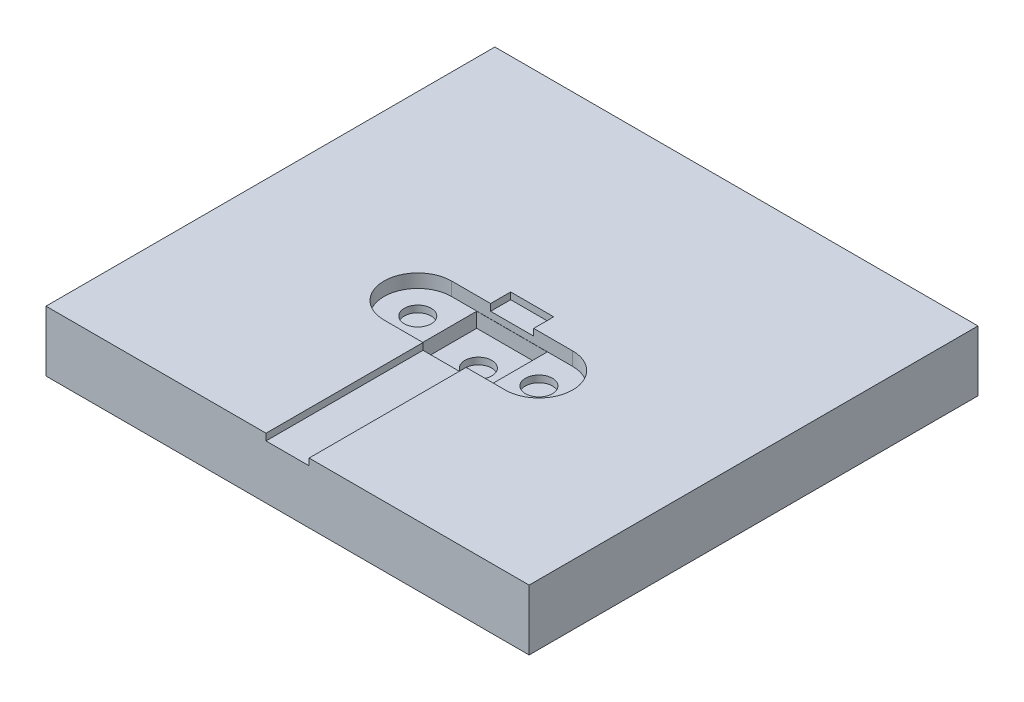
ISO-10303-21;
HEADER;
FILE_DESCRIPTION(('STEP AP214'),'2;1');
FILE_NAME('part.step','',(''),(''),'','','');
FILE_SCHEMA(('AUTOMOTIVE_DESIGN { 1 0 10303 214 1 1 1 1 }'));
ENDSEC;
DATA;
#1=APPLICATION_CONTEXT('core data for automotive mechanical design processes');
#2=APPLICATION_PROTOCOL_DEFINITION('international standard','automotive_design',2000,#1);
#3=PRODUCT_CONTEXT('',#1,'mechanical');
#4=PRODUCT('Part','Part','',(#3));
#5=PRODUCT_RELATED_PRODUCT_CATEGORY('part','',(#4));
#6=PRODUCT_DEFINITION_FORMATION('','',#4);
#7=PRODUCT_DEFINITION_CONTEXT('part definition',#1,'design');
#8=PRODUCT_DEFINITION('design','',#6,#7);
#9=PRODUCT_DEFINITION_SHAPE('','',#8);
#10=(LENGTH_UNIT() NAMED_UNIT(*) SI_UNIT(.MILLI.,.METRE.));
#11=(NAMED_UNIT(*) PLANE_ANGLE_UNIT() SI_UNIT($,.RADIAN.));
#12=(NAMED_UNIT(*) SI_UNIT($,.STERADIAN.) SOLID_ANGLE_UNIT());
#13=UNCERTAINTY_MEASURE_WITH_UNIT(LENGTH_MEASURE(1.E-05),#10,'distance_accuracy_value','');
#14=(GEOMETRIC_REPRESENTATION_CONTEXT(3) GLOBAL_UNCERTAINTY_ASSIGNED_CONTEXT((#13)) GLOBAL_UNIT_ASSIGNED_CONTEXT((#10,
#11,#12)) REPRESENTATION_CONTEXT('',''));
#15=CARTESIAN_POINT('',(0.,0.,0.));
#16=DIRECTION('',(0.,0.,1.));
#17=DIRECTION('',(1.,0.,0.));
#18=AXIS2_PLACEMENT_3D('',#15,#16,#17);
#19=CARTESIAN_POINT('',(33.2622597352939,7.,-145.28784522555));
#20=DIRECTION('',(0.,1.,0.));
#21=DIRECTION('',(0.,0.,1.));
#22=AXIS2_PLACEMENT_3D('',#19,#20,#21);
#23=CYLINDRICAL_SURFACE('',#22,5.02261182793393);
#24=CARTESIAN_POINT('',(33.2622597352939,9.,-145.28784522555));
#25=DIRECTION('',(0.,1.,0.));
#26=DIRECTION('',(0.,0.,1.));
#27=AXIS2_PLACEMENT_3D('',#24,#25,#26);
#28=CIRCLE('',#27,5.02261182793393);
#29=CARTESIAN_POINT('',(33.2622597352939,9.,-140.265233397616));
#30=VERTEX_POINT('',#29);
#31=CARTESIAN_POINT('',(33.2622597352939,9.,-150.310457053484));
#32=VERTEX_POINT('',#31);
#33=EDGE_CURVE('E260',#30,#32,#28,.F.);
#34=ORIENTED_EDGE('',*,*,#33,.F.);
#35=DIRECTION('',(0.,1.,0.));
#36=VECTOR('',#35,1.);
#37=CARTESIAN_POINT('',(33.2622597352939,7.,-140.265233397616));
#38=LINE('',#37,#36);
#39=CARTESIAN_POINT('',(33.2622597352939,7.,-140.265233397616));
#40=VERTEX_POINT('',#39);
#41=EDGE_CURVE('E282',#40,#30,#38,.T.);
#42=ORIENTED_EDGE('',*,*,#41,.F.);
#43=CARTESIAN_POINT('',(33.2622597352939,7.,-145.28784522555));
#44=DIRECTION('',(0.,1.,0.));
#45=DIRECTION('',(0.,0.,1.));
#46=AXIS2_PLACEMENT_3D('',#43,#44,#45);
#47=CIRCLE('',#46,5.02261182793393);
#48=CARTESIAN_POINT('',(33.2622597352939,7.,-150.310457053484));
#49=VERTEX_POINT('',#48);
#50=EDGE_CURVE('E269',#49,#40,#47,.T.);
#51=ORIENTED_EDGE('',*,*,#50,.F.);
#52=DIRECTION('',(0.,1.,0.));
#53=VECTOR('',#52,1.);
#54=CARTESIAN_POINT('',(33.2622597352939,7.,-150.310457053484));
#55=LINE('',#54,#53);
#56=EDGE_CURVE('E283',#49,#32,#55,.T.);
#57=ORIENTED_EDGE('',*,*,#56,.T.);
#58=EDGE_LOOP('',(#34,#42,#51,#57));
#59=FACE_BOUND('',#58,.T.);
#60=ADVANCED_FACE('F36',(#59),#23,.F.);
#61=CARTESIAN_POINT('',(33.2622597352939,7.,-150.310457053484));
#62=DIRECTION('',(0.,0.,-1.));
#63=DIRECTION('',(-1.,0.,0.));
#64=AXIS2_PLACEMENT_3D('',#61,#62,#63);
#65=PLANE('',#64);
#66=DIRECTION('',(1.,0.,0.));
#67=VECTOR('',#66,1.);
#68=CARTESIAN_POINT('',(33.2622597352939,8.00000000000001,-150.310457053484));
#69=LINE('',#68,#67);
#70=CARTESIAN_POINT('',(39.062259735296,8.00000000000001,-150.310457053484));
#71=VERTEX_POINT('',#70);
#72=CARTESIAN_POINT('',(45.462259735294,8.00000000000002,-150.310457053484));
#73=VERTEX_POINT('',#72);
#74=EDGE_CURVE('E209',#71,#73,#69,.T.);
#75=ORIENTED_EDGE('',*,*,#74,.F.);
#76=DIRECTION('',(0.,1.,0.));
#77=VECTOR('',#76,1.);
#78=CARTESIAN_POINT('',(39.062259735296,7.,-150.310457053484));
#79=LINE('',#78,#77);
#80=CARTESIAN_POINT('',(39.062259735296,9.00000000000001,-150.310457053484));
#81=VERTEX_POINT('',#80);
#82=EDGE_CURVE('E216',#71,#81,#79,.T.);
#83=ORIENTED_EDGE('',*,*,#82,.T.);
#84=DIRECTION('',(1.,0.,0.));
#85=VECTOR('',#84,1.);
#86=CARTESIAN_POINT('',(33.2622597352939,9.,-150.310457053484));
#87=LINE('',#86,#85);
#88=EDGE_CURVE('E257',#32,#81,#87,.T.);
#89=ORIENTED_EDGE('',*,*,#88,.F.);
#90=ORIENTED_EDGE('',*,*,#56,.F.);
#91=DIRECTION('',(-1.,0.,0.));
#92=VECTOR('',#91,1.);
#93=CARTESIAN_POINT('',(33.2622597352939,7.,-150.310457053484));
#94=LINE('',#93,#92);
#95=CARTESIAN_POINT('',(51.262259735294,7.,-150.310457053484));
#96=VERTEX_POINT('',#95);
#97=EDGE_CURVE('E279',#96,#49,#94,.T.);
#98=ORIENTED_EDGE('',*,*,#97,.F.);
#99=DIRECTION('',(0.,1.,0.));
#100=VECTOR('',#99,1.);
#101=CARTESIAN_POINT('',(51.262259735294,7.,-150.310457053484));
#102=LINE('',#101,#100);
#103=CARTESIAN_POINT('',(51.262259735294,9.,-150.310457053484));
#104=VERTEX_POINT('',#103);
#105=EDGE_CURVE('E287',#96,#104,#102,.T.);
#106=ORIENTED_EDGE('',*,*,#105,.T.);
#107=CARTESIAN_POINT('',(45.462259735294,9.,-150.310457053484));
#108=VERTEX_POINT('',#107);
#109=EDGE_CURVE('E256',#108,#104,#87,.T.);
#110=ORIENTED_EDGE('',*,*,#109,.F.);
#111=DIRECTION('',(0.,-1.,0.));
#112=VECTOR('',#111,1.);
#113=CARTESIAN_POINT('',(45.462259735294,7.00000000000001,-150.310457053484));
#114=LINE('',#113,#112);
#115=EDGE_CURVE('E52',#108,#73,#114,.T.);
#116=ORIENTED_EDGE('',*,*,#115,.T.);
#117=EDGE_LOOP('',(#75,#83,#89,#90,#98,#106,#110,#116));
#118=FACE_BOUND('',#117,.T.);
#119=ADVANCED_FACE('F362',(#118),#65,.F.);
#120=CARTESIAN_POINT('',(51.262259735294,7.,-145.28784522555));
#121=DIRECTION('',(0.,1.,0.));
#122=DIRECTION('',(0.,0.,1.));
#123=AXIS2_PLACEMENT_3D('',#120,#121,#122);
#124=CYLINDRICAL_SURFACE('',#123,5.02261182793393);
#125=CARTESIAN_POINT('',(51.262259735294,9.,-145.28784522555));
#126=DIRECTION('',(0.,1.,0.));
#127=DIRECTION('',(0.,0.,1.));
#128=AXIS2_PLACEMENT_3D('',#125,#126,#127);
#129=CIRCLE('',#128,5.02261182793393);
#130=CARTESIAN_POINT('',(51.262259735294,9.,-140.265233397616));
#131=VERTEX_POINT('',#130);
#132=EDGE_CURVE('E254',#104,#131,#129,.F.);
#133=ORIENTED_EDGE('',*,*,#132,.F.);
#134=ORIENTED_EDGE('',*,*,#105,.F.);
#135=CARTESIAN_POINT('',(51.262259735294,7.,-145.28784522555));
#136=DIRECTION('',(0.,1.,0.));
#137=DIRECTION('',(0.,0.,1.));
#138=AXIS2_PLACEMENT_3D('',#135,#136,#137);
#139=CIRCLE('',#138,5.02261182793393);
#140=CARTESIAN_POINT('',(51.262259735294,7.,-140.265233397616));
#141=VERTEX_POINT('',#140);
#142=EDGE_CURVE('E276',#141,#96,#139,.T.);
#143=ORIENTED_EDGE('',*,*,#142,.F.);
#144=DIRECTION('',(0.,1.,0.));
#145=VECTOR('',#144,1.);
#146=CARTESIAN_POINT('',(51.262259735294,7.,-140.265233397616));
#147=LINE('',#146,#145);
#148=EDGE_CURVE('E290',#141,#131,#147,.T.);
#149=ORIENTED_EDGE('',*,*,#148,.T.);
#150=EDGE_LOOP('',(#133,#134,#143,#149));
#151=FACE_BOUND('',#150,.T.);
#152=ADVANCED_FACE('F368',(#151),#124,.F.);
#153=CARTESIAN_POINT('',(33.2622597352939,7.,-140.265233397616));
#154=DIRECTION('',(0.,0.,1.));
#155=DIRECTION('',(1.,0.,0.));
#156=AXIS2_PLACEMENT_3D('',#153,#154,#155);
#157=PLANE('',#156);
#158=DIRECTION('',(-1.,0.,0.));
#159=VECTOR('',#158,1.);
#160=CARTESIAN_POINT('',(33.2622597352939,9.,-140.265233397616));
#161=LINE('',#160,#159);
#162=CARTESIAN_POINT('',(39.062259735296,9.00000000000001,-140.265233397616));
#163=VERTEX_POINT('',#162);
#164=EDGE_CURVE('E314',#163,#30,#161,.T.);
#165=ORIENTED_EDGE('',*,*,#164,.F.);
#166=DIRECTION('',(0.,-1.,0.));
#167=VECTOR('',#166,1.);
#168=CARTESIAN_POINT('',(39.062259735296,7.,-140.265233397616));
#169=LINE('',#168,#167);
#170=CARTESIAN_POINT('',(39.062259735296,8.00000000000001,-140.265233397616));
#171=VERTEX_POINT('',#170);
#172=EDGE_CURVE('E213',#163,#171,#169,.T.);
#173=ORIENTED_EDGE('',*,*,#172,.T.);
#174=DIRECTION('',(-1.,0.,0.));
#175=VECTOR('',#174,1.);
#176=CARTESIAN_POINT('',(33.2622597352939,8.00000000000001,-140.265233397616));
#177=LINE('',#176,#175);
#178=CARTESIAN_POINT('',(45.462259735294,8.00000000000002,-140.265233397616));
#179=VERTEX_POINT('',#178);
#180=EDGE_CURVE('E207',#179,#171,#177,.T.);
#181=ORIENTED_EDGE('',*,*,#180,.F.);
#182=DIRECTION('',(0.,1.,0.));
#183=VECTOR('',#182,1.);
#184=CARTESIAN_POINT('',(45.462259735294,7.00000000000001,-140.265233397616));
#185=LINE('',#184,#183);
#186=CARTESIAN_POINT('',(45.462259735294,9.00000000000002,-140.265233397616));
#187=VERTEX_POINT('',#186);
#188=EDGE_CURVE('E182',#179,#187,#185,.T.);
#189=ORIENTED_EDGE('',*,*,#188,.T.);
#190=EDGE_CURVE('E319',#131,#187,#161,.T.);
#191=ORIENTED_EDGE('',*,*,#190,.F.);
#192=ORIENTED_EDGE('',*,*,#148,.F.);
#193=DIRECTION('',(1.,0.,0.));
#194=VECTOR('',#193,1.);
#195=CARTESIAN_POINT('',(33.2622597352939,7.,-140.265233397616));
#196=LINE('',#195,#194);
#197=EDGE_CURVE('E272',#40,#141,#196,.T.);
#198=ORIENTED_EDGE('',*,*,#197,.F.);
#199=ORIENTED_EDGE('',*,*,#41,.T.);
#200=EDGE_LOOP('',(#165,#173,#181,#189,#191,#192,#198,#199));
#201=FACE_BOUND('',#200,.T.);
#202=ADVANCED_FACE('F374',(#201),#157,.F.);
#203=CARTESIAN_POINT('',(33.2622597352939,7.,-145.28784522555));
#204=DIRECTION('',(0.,1.,0.));
#205=DIRECTION('',(0.,0.,1.));
#206=AXIS2_PLACEMENT_3D('',#203,#204,#205);
#207=PLANE('',#206);
#208=DIRECTION('',(0.,0.,1.));
#209=VECTOR('',#208,1.);
#210=CARTESIAN_POINT('',(37.0210918808928,7.,-145.28784522555));
#211=LINE('',#210,#209);
#212=CARTESIAN_POINT('',(37.0210918808928,7.,-150.287845225551));
#213=VERTEX_POINT('',#212);
#214=CARTESIAN_POINT('',(37.0210918808928,7.,-140.287845225551));
#215=VERTEX_POINT('',#214);
#216=EDGE_CURVE('E11',#213,#215,#211,.T.);
#217=ORIENTED_EDGE('',*,*,#216,.F.);
#218=DIRECTION('',(-1.,0.,0.));
#219=VECTOR('',#218,1.);
#220=CARTESIAN_POINT('',(33.2622597352939,7.,-150.287845225551));
#221=LINE('',#220,#219);
#222=CARTESIAN_POINT('',(47.5034275896992,7.,-150.287845225551));
#223=VERTEX_POINT('',#222);
#224=EDGE_CURVE('E45',#223,#213,#221,.T.);
#225=ORIENTED_EDGE('',*,*,#224,.F.);
#226=DIRECTION('',(0.,0.,-1.));
#227=VECTOR('',#226,1.);
#228=CARTESIAN_POINT('',(47.5034275896992,7.,-145.28784522555));
#229=LINE('',#228,#227);
#230=CARTESIAN_POINT('',(47.5034275896993,7.,-140.287845225551));
#231=VERTEX_POINT('',#230);
#232=EDGE_CURVE('E324',#231,#223,#229,.T.);
#233=ORIENTED_EDGE('',*,*,#232,.F.);
#234=DIRECTION('',(1.,0.,0.));
#235=VECTOR('',#234,1.);
#236=CARTESIAN_POINT('',(33.2622597352939,7.,-140.287845225551));
#237=LINE('',#236,#235);
#238=EDGE_CURVE('E322',#215,#231,#237,.T.);
#239=ORIENTED_EDGE('',*,*,#238,.F.);
#240=EDGE_LOOP('',(#217,#225,#233,#239));
#241=FACE_BOUND('',#240,.T.);
#242=CARTESIAN_POINT('',(51.262259735294,7.,-145.28784522555));
#243=DIRECTION('',(0.,1.,0.));
#244=DIRECTION('',(0.,0.,1.));
#245=AXIS2_PLACEMENT_3D('',#242,#243,#244);
#246=CIRCLE('',#245,2.);
#247=CARTESIAN_POINT('',(51.262259735294,7.,-143.28784522555));
#248=VERTEX_POINT('',#247);
#249=EDGE_CURVE('E273',#248,#248,#246,.T.);
#250=ORIENTED_EDGE('',*,*,#249,.F.);
#251=EDGE_LOOP('',(#250));
#252=FACE_BOUND('',#251,.T.);
#253=CARTESIAN_POINT('',(33.2622597352939,7.,-145.28784522555));
#254=DIRECTION('',(0.,1.,0.));
#255=DIRECTION('',(0.,0.,1.));
#256=AXIS2_PLACEMENT_3D('',#253,#254,#255);
#257=CIRCLE('',#256,2.);
#258=CARTESIAN_POINT('',(33.2622597352939,7.,-143.28784522555));
#259=VERTEX_POINT('',#258);
#260=EDGE_CURVE('E266',#259,#259,#257,.T.);
#261=ORIENTED_EDGE('',*,*,#260,.F.);
#262=EDGE_LOOP('',(#261));
#263=FACE_BOUND('',#262,.T.);
#264=ORIENTED_EDGE('',*,*,#50,.T.);
#265=ORIENTED_EDGE('',*,*,#197,.T.);
#266=ORIENTED_EDGE('',*,*,#142,.T.);
#267=ORIENTED_EDGE('',*,*,#97,.T.);
#268=EDGE_LOOP('',(#264,#265,#266,#267));
#269=FACE_BOUND('',#268,.T.);
#270=ADVANCED_FACE('F337',(#241,#252,#263,#269),#207,.T.);
#271=CARTESIAN_POINT('',(33.2622597352939,6.,-145.28784522555));
#272=DIRECTION('',(0.,1.,0.));
#273=DIRECTION('',(0.,0.,1.));
#274=AXIS2_PLACEMENT_3D('',#271,#272,#273);
#275=CYLINDRICAL_SURFACE('',#274,2.);
#276=ORIENTED_EDGE('',*,*,#260,.T.);
#277=EDGE_LOOP('',(#276));
#278=FACE_BOUND('',#277,.T.);
#279=CARTESIAN_POINT('',(33.2622597352939,6.,-145.28784522555));
#280=DIRECTION('',(0.,1.,0.));
#281=DIRECTION('',(0.,0.,1.));
#282=AXIS2_PLACEMENT_3D('',#279,#280,#281);
#283=CIRCLE('',#282,2.);
#284=CARTESIAN_POINT('',(33.2622597352939,6.,-143.28784522555));
#285=VERTEX_POINT('',#284);
#286=EDGE_CURVE('E262',#285,#285,#283,.T.);
#287=ORIENTED_EDGE('',*,*,#286,.F.);
#288=EDGE_LOOP('',(#287));
#289=FACE_BOUND('',#288,.T.);
#290=ADVANCED_FACE('F443',(#278,#289),#275,.F.);
#291=CARTESIAN_POINT('',(33.2622597352939,6.,-145.28784522555));
#292=DIRECTION('',(0.,1.,0.));
#293=DIRECTION('',(0.,0.,1.));
#294=AXIS2_PLACEMENT_3D('',#291,#292,#293);
#295=PLANE('',#294);
#296=ORIENTED_EDGE('',*,*,#286,.T.);
#297=EDGE_LOOP('',(#296));
#298=FACE_BOUND('',#297,.T.);
#299=ADVANCED_FACE('F449',(#298),#295,.T.);
#300=CARTESIAN_POINT('',(51.262259735294,6.,-145.28784522555));
#301=DIRECTION('',(0.,1.,0.));
#302=DIRECTION('',(0.,0.,1.));
#303=AXIS2_PLACEMENT_3D('',#300,#301,#302);
#304=CYLINDRICAL_SURFACE('',#303,2.);
#305=ORIENTED_EDGE('',*,*,#249,.T.);
#306=EDGE_LOOP('',(#305));
#307=FACE_BOUND('',#306,.T.);
#308=CARTESIAN_POINT('',(51.262259735294,6.,-145.28784522555));
#309=DIRECTION('',(0.,1.,0.));
#310=DIRECTION('',(0.,0.,1.));
#311=AXIS2_PLACEMENT_3D('',#308,#309,#310);
#312=CIRCLE('',#311,2.);
#313=CARTESIAN_POINT('',(51.262259735294,6.,-143.28784522555));
#314=VERTEX_POINT('',#313);
#315=EDGE_CURVE('E263',#314,#314,#312,.T.);
#316=ORIENTED_EDGE('',*,*,#315,.F.);
#317=EDGE_LOOP('',(#316));
#318=FACE_BOUND('',#317,.T.);
#319=ADVANCED_FACE('F652',(#307,#318),#304,.F.);
#320=CARTESIAN_POINT('',(51.262259735294,6.,-145.28784522555));
#321=DIRECTION('',(0.,1.,0.));
#322=DIRECTION('',(0.,0.,1.));
#323=AXIS2_PLACEMENT_3D('',#320,#321,#322);
#324=PLANE('',#323);
#325=ORIENTED_EDGE('',*,*,#315,.T.);
#326=EDGE_LOOP('',(#325));
#327=FACE_BOUND('',#326,.T.);
#328=ADVANCED_FACE('F476',(#327),#324,.T.);
#329=CARTESIAN_POINT('',(0.,9.,0.));
#330=DIRECTION('',(0.,1.,0.));
#331=DIRECTION('',(0.,0.,1.));
#332=AXIS2_PLACEMENT_3D('',#329,#330,#331);
#333=PLANE('',#332);
#334=DIRECTION('',(0.,0.,1.));
#335=VECTOR('',#334,1.);
#336=CARTESIAN_POINT('',(39.062259735296,9.00000000000001,-153.28784522555));
#337=LINE('',#336,#335);
#338=CARTESIAN_POINT('',(39.0622597352961,9.00000000000001,-116.935066333168));
#339=VERTEX_POINT('',#338);
#340=EDGE_CURVE('E406',#163,#339,#337,.T.);
#341=ORIENTED_EDGE('',*,*,#340,.F.);
#342=ORIENTED_EDGE('',*,*,#164,.T.);
#343=ORIENTED_EDGE('',*,*,#33,.T.);
#344=ORIENTED_EDGE('',*,*,#88,.T.);
#345=CARTESIAN_POINT('',(39.062259735296,9.00000000000001,-153.28784522555));
#346=VERTEX_POINT('',#345);
#347=EDGE_CURVE('E408',#346,#81,#337,.T.);
#348=ORIENTED_EDGE('',*,*,#347,.F.);
#349=DIRECTION('',(-1.,0.,0.));
#350=VECTOR('',#349,1.);
#351=CARTESIAN_POINT('',(39.062259735296,9.00000000000001,-153.28784522555));
#352=LINE('',#351,#350);
#353=CARTESIAN_POINT('',(45.462259735294,9.00000000000002,-153.28784522555));
#354=VERTEX_POINT('',#353);
#355=EDGE_CURVE('E426',#354,#346,#352,.T.);
#356=ORIENTED_EDGE('',*,*,#355,.F.);
#357=DIRECTION('',(0.,0.,-1.));
#358=VECTOR('',#357,1.);
#359=CARTESIAN_POINT('',(45.462259735294,9.00000000000002,-153.28784522555));
#360=LINE('',#359,#358);
#361=EDGE_CURVE('E429',#108,#354,#360,.T.);
#362=ORIENTED_EDGE('',*,*,#361,.F.);
#363=ORIENTED_EDGE('',*,*,#109,.T.);
#364=ORIENTED_EDGE('',*,*,#132,.T.);
#365=ORIENTED_EDGE('',*,*,#190,.T.);
#366=CARTESIAN_POINT('',(45.462259735294,9.00000000000002,-116.935066333168));
#367=VERTEX_POINT('',#366);
#368=EDGE_CURVE('E430',#367,#187,#360,.T.);
#369=ORIENTED_EDGE('',*,*,#368,.F.);
#370=DIRECTION('',(1.,0.,0.));
#371=VECTOR('',#370,1.);
#372=CARTESIAN_POINT('',(0.,9.,-116.935066333168));
#373=LINE('',#372,#371);
#374=CARTESIAN_POINT('',(78.1607350948918,9.,-116.935066333168));
#375=VERTEX_POINT('',#374);
#376=EDGE_CURVE('E198',#367,#375,#373,.T.);
#377=ORIENTED_EDGE('',*,*,#376,.T.);
#378=DIRECTION('',(0.,0.,-1.));
#379=VECTOR('',#378,1.);
#380=CARTESIAN_POINT('',(78.1607350948918,9.,0.));
#381=LINE('',#380,#379);
#382=CARTESIAN_POINT('',(78.1607350948918,9.,-183.640624117932));
#383=VERTEX_POINT('',#382);
#384=EDGE_CURVE('E248',#375,#383,#381,.T.);
#385=ORIENTED_EDGE('',*,*,#384,.T.);
#386=DIRECTION('',(-1.,0.,0.));
#387=VECTOR('',#386,1.);
#388=CARTESIAN_POINT('',(0.,9.,-183.640624117932));
#389=LINE('',#388,#387);
#390=CARTESIAN_POINT('',(6.36378437569612,9.,-183.640624117932));
#391=VERTEX_POINT('',#390);
#392=EDGE_CURVE('E250',#383,#391,#389,.T.);
#393=ORIENTED_EDGE('',*,*,#392,.T.);
#394=DIRECTION('',(0.,0.,1.));
#395=VECTOR('',#394,1.);
#396=CARTESIAN_POINT('',(6.36378437569612,9.,0.));
#397=LINE('',#396,#395);
#398=CARTESIAN_POINT('',(6.36378437569612,9.,-116.935066333168));
#399=VERTEX_POINT('',#398);
#400=EDGE_CURVE('E252',#391,#399,#397,.T.);
#401=ORIENTED_EDGE('',*,*,#400,.T.);
#402=EDGE_CURVE('E245',#399,#339,#373,.T.);
#403=ORIENTED_EDGE('',*,*,#402,.T.);
#404=EDGE_LOOP('',(#341,#342,#343,#344,#348,#356,#362,#363,#364,#365,#369,#377,#385,#393,#401,#403));
#405=FACE_BOUND('',#404,.T.);
#406=ADVANCED_FACE('F379',(#405),#333,.T.);
#407=CARTESIAN_POINT('',(0.,0.,0.));
#408=DIRECTION('',(0.,-1.,0.));
#409=DIRECTION('',(0.,0.,-1.));
#410=AXIS2_PLACEMENT_3D('',#407,#408,#409);
#411=PLANE('',#410);
#412=DIRECTION('',(0.,0.,-1.));
#413=VECTOR('',#412,1.);
#414=CARTESIAN_POINT('',(78.1607350948918,0.,-116.935066333168));
#415=LINE('',#414,#413);
#416=CARTESIAN_POINT('',(78.1607350948918,0.,-116.935066333168));
#417=VERTEX_POINT('',#416);
#418=CARTESIAN_POINT('',(78.1607350948918,0.,-183.640624117932));
#419=VERTEX_POINT('',#418);
#420=EDGE_CURVE('E286',#417,#419,#415,.T.);
#421=ORIENTED_EDGE('',*,*,#420,.F.);
#422=DIRECTION('',(1.,0.,0.));
#423=VECTOR('',#422,1.);
#424=CARTESIAN_POINT('',(6.36378437569612,0.,-116.935066333168));
#425=LINE('',#424,#423);
#426=CARTESIAN_POINT('',(6.36378437569612,0.,-116.935066333168));
#427=VERTEX_POINT('',#426);
#428=EDGE_CURVE('E303',#427,#417,#425,.T.);
#429=ORIENTED_EDGE('',*,*,#428,.F.);
#430=DIRECTION('',(0.,0.,1.));
#431=VECTOR('',#430,1.);
#432=CARTESIAN_POINT('',(6.36378437569612,0.,-116.935066333168));
#433=LINE('',#432,#431);
#434=CARTESIAN_POINT('',(6.36378437569612,0.,-183.640624117932));
#435=VERTEX_POINT('',#434);
#436=EDGE_CURVE('E300',#435,#427,#433,.T.);
#437=ORIENTED_EDGE('',*,*,#436,.F.);
#438=DIRECTION('',(-1.,0.,0.));
#439=VECTOR('',#438,1.);
#440=CARTESIAN_POINT('',(6.36378437569612,0.,-183.640624117932));
#441=LINE('',#440,#439);
#442=EDGE_CURVE('E297',#419,#435,#441,.T.);
#443=ORIENTED_EDGE('',*,*,#442,.F.);
#444=EDGE_LOOP('',(#421,#429,#437,#443));
#445=FACE_BOUND('',#444,.T.);
#446=ADVANCED_FACE('F376',(#445),#411,.T.);
#447=CARTESIAN_POINT('',(6.36378437569612,10.,-116.935066333168));
#448=DIRECTION('',(0.,0.,-1.));
#449=DIRECTION('',(-1.,0.,0.));
#450=AXIS2_PLACEMENT_3D('',#447,#448,#449);
#451=PLANE('',#450);
#452=DIRECTION('',(1.,0.,0.));
#453=VECTOR('',#452,1.);
#454=CARTESIAN_POINT('',(39.0622597352961,8.00000000000001,-116.935066333168));
#455=LINE('',#454,#453);
#456=CARTESIAN_POINT('',(39.062259735296,8.00000000000001,-116.935066333168));
#457=VERTEX_POINT('',#456);
#458=CARTESIAN_POINT('',(45.462259735294,8.00000000000002,-116.935066333168));
#459=VERTEX_POINT('',#458);
#460=EDGE_CURVE('E189',#457,#459,#455,.T.);
#461=ORIENTED_EDGE('',*,*,#460,.F.);
#462=DIRECTION('',(0.,1.,0.));
#463=VECTOR('',#462,1.);
#464=CARTESIAN_POINT('',(39.0622597352961,8.00000000000001,-116.935066333168));
#465=LINE('',#464,#463);
#466=EDGE_CURVE('E60',#457,#339,#465,.T.);
#467=ORIENTED_EDGE('',*,*,#466,.T.);
#468=ORIENTED_EDGE('',*,*,#402,.F.);
#469=DIRECTION('',(0.,-1.,0.));
#470=VECTOR('',#469,1.);
#471=CARTESIAN_POINT('',(6.36378437569612,10.,-116.935066333168));
#472=LINE('',#471,#470);
#473=EDGE_CURVE('E308',#399,#427,#472,.T.);
#474=ORIENTED_EDGE('',*,*,#473,.T.);
#475=ORIENTED_EDGE('',*,*,#428,.T.);
#476=DIRECTION('',(0.,-1.,0.));
#477=VECTOR('',#476,1.);
#478=CARTESIAN_POINT('',(78.1607350948918,10.,-116.935066333168));
#479=LINE('',#478,#477);
#480=EDGE_CURVE('E306',#375,#417,#479,.T.);
#481=ORIENTED_EDGE('',*,*,#480,.F.);
#482=ORIENTED_EDGE('',*,*,#376,.F.);
#483=DIRECTION('',(0.,1.,0.));
#484=VECTOR('',#483,1.);
#485=CARTESIAN_POINT('',(45.462259735294,8.00000000000002,-116.935066333168));
#486=LINE('',#485,#484);
#487=EDGE_CURVE('E179',#459,#367,#486,.T.);
#488=ORIENTED_EDGE('',*,*,#487,.F.);
#489=EDGE_LOOP('',(#461,#467,#468,#474,#475,#481,#482,#488));
#490=FACE_BOUND('',#489,.T.);
#491=ADVANCED_FACE('F196',(#490),#451,.F.);
#492=CARTESIAN_POINT('',(6.36378437569612,10.,-116.935066333168));
#493=DIRECTION('',(1.,0.,0.));
#494=DIRECTION('',(0.,0.,-1.));
#495=AXIS2_PLACEMENT_3D('',#492,#493,#494);
#496=PLANE('',#495);
#497=ORIENTED_EDGE('',*,*,#400,.F.);
#498=DIRECTION('',(0.,-1.,0.));
#499=VECTOR('',#498,1.);
#500=CARTESIAN_POINT('',(6.36378437569612,10.,-183.640624117932));
#501=LINE('',#500,#499);
#502=EDGE_CURVE('E310',#391,#435,#501,.T.);
#503=ORIENTED_EDGE('',*,*,#502,.T.);
#504=ORIENTED_EDGE('',*,*,#436,.T.);
#505=ORIENTED_EDGE('',*,*,#473,.F.);
#506=EDGE_LOOP('',(#497,#503,#504,#505));
#507=FACE_BOUND('',#506,.T.);
#508=ADVANCED_FACE('F383',(#507),#496,.F.);
#509=CARTESIAN_POINT('',(6.36378437569612,10.,-183.640624117932));
#510=DIRECTION('',(0.,0.,1.));
#511=DIRECTION('',(1.,0.,0.));
#512=AXIS2_PLACEMENT_3D('',#509,#510,#511);
#513=PLANE('',#512);
#514=ORIENTED_EDGE('',*,*,#392,.F.);
#515=DIRECTION('',(0.,-1.,0.));
#516=VECTOR('',#515,1.);
#517=CARTESIAN_POINT('',(78.1607350948918,10.,-183.640624117932));
#518=LINE('',#517,#516);
#519=EDGE_CURVE('E312',#383,#419,#518,.T.);
#520=ORIENTED_EDGE('',*,*,#519,.T.);
#521=ORIENTED_EDGE('',*,*,#442,.T.);
#522=ORIENTED_EDGE('',*,*,#502,.F.);
#523=EDGE_LOOP('',(#514,#520,#521,#522));
#524=FACE_BOUND('',#523,.T.);
#525=ADVANCED_FACE('F385',(#524),#513,.F.);
#526=CARTESIAN_POINT('',(78.1607350948918,10.,-116.935066333168));
#527=DIRECTION('',(-1.,0.,0.));
#528=DIRECTION('',(0.,0.,1.));
#529=AXIS2_PLACEMENT_3D('',#526,#527,#528);
#530=PLANE('',#529);
#531=ORIENTED_EDGE('',*,*,#384,.F.);
#532=ORIENTED_EDGE('',*,*,#480,.T.);
#533=ORIENTED_EDGE('',*,*,#420,.T.);
#534=ORIENTED_EDGE('',*,*,#519,.F.);
#535=EDGE_LOOP('',(#531,#532,#533,#534));
#536=FACE_BOUND('',#535,.T.);
#537=ADVANCED_FACE('F38',(#536),#530,.F.);
#538=CARTESIAN_POINT('',(37.0210918808928,4.8,-150.287845225551));
#539=DIRECTION('',(-1.,0.,0.));
#540=DIRECTION('',(0.,0.,1.));
#541=AXIS2_PLACEMENT_3D('',#538,#539,#540);
#542=PLANE('',#541);
#543=ORIENTED_EDGE('',*,*,#216,.T.);
#544=DIRECTION('',(0.,1.,0.));
#545=VECTOR('',#544,1.);
#546=CARTESIAN_POINT('',(37.0210918808928,4.8,-140.287845225551));
#547=LINE('',#546,#545);
#548=CARTESIAN_POINT('',(37.0210918808928,4.8,-140.287845225551));
#549=VERTEX_POINT('',#548);
#550=EDGE_CURVE('E234',#549,#215,#547,.T.);
#551=ORIENTED_EDGE('',*,*,#550,.F.);
#552=DIRECTION('',(0.,0.,1.));
#553=VECTOR('',#552,1.);
#554=CARTESIAN_POINT('',(37.0210918808928,4.8,-150.287845225551));
#555=LINE('',#554,#553);
#556=CARTESIAN_POINT('',(37.0210918808928,4.8,-150.287845225551));
#557=VERTEX_POINT('',#556);
#558=EDGE_CURVE('E222',#557,#549,#555,.T.);
#559=ORIENTED_EDGE('',*,*,#558,.F.);
#560=DIRECTION('',(0.,1.,0.));
#561=VECTOR('',#560,1.);
#562=CARTESIAN_POINT('',(37.0210918808928,4.8,-150.287845225551));
#563=LINE('',#562,#561);
#564=EDGE_CURVE('E235',#557,#213,#563,.T.);
#565=ORIENTED_EDGE('',*,*,#564,.T.);
#566=EDGE_LOOP('',(#543,#551,#559,#565));
#567=FACE_BOUND('',#566,.T.);
#568=ADVANCED_FACE('F335',(#567),#542,.F.);
#569=CARTESIAN_POINT('',(37.0210918808928,4.8,-150.287845225551));
#570=DIRECTION('',(0.,0.,-1.));
#571=DIRECTION('',(-1.,0.,0.));
#572=AXIS2_PLACEMENT_3D('',#569,#570,#571);
#573=PLANE('',#572);
#574=ORIENTED_EDGE('',*,*,#224,.T.);
#575=ORIENTED_EDGE('',*,*,#564,.F.);
#576=DIRECTION('',(-1.,0.,0.));
#577=VECTOR('',#576,1.);
#578=CARTESIAN_POINT('',(37.0210918808928,4.8,-150.287845225551));
#579=LINE('',#578,#577);
#580=CARTESIAN_POINT('',(47.5034275896992,4.8,-150.287845225551));
#581=VERTEX_POINT('',#580);
#582=EDGE_CURVE('E231',#581,#557,#579,.T.);
#583=ORIENTED_EDGE('',*,*,#582,.F.);
#584=DIRECTION('',(0.,1.,0.));
#585=VECTOR('',#584,1.);
#586=CARTESIAN_POINT('',(47.5034275896992,4.8,-150.287845225551));
#587=LINE('',#586,#585);
#588=EDGE_CURVE('E238',#581,#223,#587,.T.);
#589=ORIENTED_EDGE('',*,*,#588,.T.);
#590=EDGE_LOOP('',(#574,#575,#583,#589));
#591=FACE_BOUND('',#590,.T.);
#592=ADVANCED_FACE('F328',(#591),#573,.F.);
#593=CARTESIAN_POINT('',(47.5034275896992,4.8,-150.287845225551));
#594=DIRECTION('',(1.,0.,0.));
#595=DIRECTION('',(0.,0.,-1.));
#596=AXIS2_PLACEMENT_3D('',#593,#594,#595);
#597=PLANE('',#596);
#598=ORIENTED_EDGE('',*,*,#232,.T.);
#599=ORIENTED_EDGE('',*,*,#588,.F.);
#600=DIRECTION('',(0.,0.,-1.));
#601=VECTOR('',#600,1.);
#602=CARTESIAN_POINT('',(47.5034275896992,4.8,-150.287845225551));
#603=LINE('',#602,#601);
#604=CARTESIAN_POINT('',(47.5034275896993,4.8,-140.287845225551));
#605=VERTEX_POINT('',#604);
#606=EDGE_CURVE('E228',#605,#581,#603,.T.);
#607=ORIENTED_EDGE('',*,*,#606,.F.);
#608=DIRECTION('',(0.,1.,0.));
#609=VECTOR('',#608,1.);
#610=CARTESIAN_POINT('',(47.5034275896993,4.8,-140.287845225551));
#611=LINE('',#610,#609);
#612=EDGE_CURVE('E241',#605,#231,#611,.T.);
#613=ORIENTED_EDGE('',*,*,#612,.T.);
#614=EDGE_LOOP('',(#598,#599,#607,#613));
#615=FACE_BOUND('',#614,.T.);
#616=ADVANCED_FACE('F344',(#615),#597,.F.);
#617=CARTESIAN_POINT('',(37.0210918808928,4.8,-140.287845225551));
#618=DIRECTION('',(0.,0.,1.));
#619=DIRECTION('',(1.,0.,0.));
#620=AXIS2_PLACEMENT_3D('',#617,#618,#619);
#621=PLANE('',#620);
#622=ORIENTED_EDGE('',*,*,#238,.T.);
#623=ORIENTED_EDGE('',*,*,#612,.F.);
#624=DIRECTION('',(1.,0.,0.));
#625=VECTOR('',#624,1.);
#626=CARTESIAN_POINT('',(37.0210918808928,4.8,-140.287845225551));
#627=LINE('',#626,#625);
#628=EDGE_CURVE('E225',#549,#605,#627,.T.);
#629=ORIENTED_EDGE('',*,*,#628,.F.);
#630=ORIENTED_EDGE('',*,*,#550,.T.);
#631=EDGE_LOOP('',(#622,#623,#629,#630));
#632=FACE_BOUND('',#631,.T.);
#633=ADVANCED_FACE('F340',(#632),#621,.F.);
#634=CARTESIAN_POINT('',(0.,4.8,0.));
#635=DIRECTION('',(0.,1.,0.));
#636=DIRECTION('',(0.,0.,1.));
#637=AXIS2_PLACEMENT_3D('',#634,#635,#636);
#638=PLANE('',#637);
#639=CARTESIAN_POINT('',(42.262259735296,4.8,-145.287845225551));
#640=DIRECTION('',(0.,1.,0.));
#641=DIRECTION('',(0.,0.,1.));
#642=AXIS2_PLACEMENT_3D('',#639,#640,#641);
#643=CIRCLE('',#642,1.99999999999762);
#644=CARTESIAN_POINT('',(42.262259735296,4.8,-143.287845225554));
#645=VERTEX_POINT('',#644);
#646=EDGE_CURVE('E40',#645,#645,#643,.T.);
#647=ORIENTED_EDGE('',*,*,#646,.F.);
#648=EDGE_LOOP('',(#647));
#649=FACE_BOUND('',#648,.T.);
#650=ORIENTED_EDGE('',*,*,#558,.T.);
#651=ORIENTED_EDGE('',*,*,#628,.T.);
#652=ORIENTED_EDGE('',*,*,#606,.T.);
#653=ORIENTED_EDGE('',*,*,#582,.T.);
#654=EDGE_LOOP('',(#650,#651,#652,#653));
#655=FACE_BOUND('',#654,.T.);
#656=ADVANCED_FACE('F346',(#649,#655),#638,.T.);
#657=CARTESIAN_POINT('',(42.262259735296,3.8,-145.287845225551));
#658=DIRECTION('',(0.,1.,0.));
#659=DIRECTION('',(0.,0.,1.));
#660=AXIS2_PLACEMENT_3D('',#657,#658,#659);
#661=CYLINDRICAL_SURFACE('',#660,1.99999999999762);
#662=CARTESIAN_POINT('',(42.262259735296,3.8,-145.287845225551));
#663=DIRECTION('',(0.,1.,0.));
#664=DIRECTION('',(0.,0.,1.));
#665=AXIS2_PLACEMENT_3D('',#662,#663,#664);
#666=CIRCLE('',#665,1.99999999999762);
#667=CARTESIAN_POINT('',(42.262259735296,3.8,-143.287845225554));
#668=VERTEX_POINT('',#667);
#669=EDGE_CURVE('E219',#668,#668,#666,.T.);
#670=CARTESIAN_POINT('',(42.262259735296,4.8,-143.287845225554));
#671=CARTESIAN_POINT('',(42.262259735296,4.78958333333333,-143.287845225554));
#672=CARTESIAN_POINT('',(42.262259735296,4.77916666666667,-143.287845225554));
#673=CARTESIAN_POINT('',(42.262259735296,4.75833333333333,-143.287845225554));
#674=CARTESIAN_POINT('',(42.262259735296,4.74791666666667,-143.287845225554));
#675=CARTESIAN_POINT('',(42.262259735296,4.72708333333333,-143.287845225554));
#676=CARTESIAN_POINT('',(42.262259735296,4.71666666666667,-143.287845225554));
#677=CARTESIAN_POINT('',(42.262259735296,4.69583333333333,-143.287845225554));
#678=CARTESIAN_POINT('',(42.262259735296,4.68541666666667,-143.287845225554));
#679=CARTESIAN_POINT('',(42.262259735296,4.66458333333333,-143.287845225554));
#680=CARTESIAN_POINT('',(42.262259735296,4.65416666666667,-143.287845225554));
#681=CARTESIAN_POINT('',(42.262259735296,4.63333333333333,-143.287845225554));
#682=CARTESIAN_POINT('',(42.262259735296,4.62291666666667,-143.287845225554));
#683=CARTESIAN_POINT('',(42.262259735296,4.60208333333333,-143.287845225554));
#684=CARTESIAN_POINT('',(42.262259735296,4.59166666666667,-143.287845225554));
#685=CARTESIAN_POINT('',(42.262259735296,4.57083333333333,-143.287845225554));
#686=CARTESIAN_POINT('',(42.262259735296,4.56041666666667,-143.287845225554));
#687=CARTESIAN_POINT('',(42.262259735296,4.53958333333333,-143.287845225554));
#688=CARTESIAN_POINT('',(42.262259735296,4.52916666666667,-143.287845225554));
#689=CARTESIAN_POINT('',(42.262259735296,4.50833333333333,-143.287845225554));
#690=CARTESIAN_POINT('',(42.262259735296,4.49791666666667,-143.287845225554));
#691=CARTESIAN_POINT('',(42.262259735296,4.47708333333333,-143.287845225554));
#692=CARTESIAN_POINT('',(42.262259735296,4.46666666666667,-143.287845225554));
#693=CARTESIAN_POINT('',(42.262259735296,4.44583333333333,-143.287845225554));
#694=CARTESIAN_POINT('',(42.262259735296,4.43541666666667,-143.287845225554));
#695=CARTESIAN_POINT('',(42.262259735296,4.41458333333333,-143.287845225554));
#696=CARTESIAN_POINT('',(42.262259735296,4.40416666666667,-143.287845225554));
#697=CARTESIAN_POINT('',(42.262259735296,4.38333333333333,-143.287845225554));
#698=CARTESIAN_POINT('',(42.262259735296,4.37291666666667,-143.287845225554));
#699=CARTESIAN_POINT('',(42.262259735296,4.35208333333333,-143.287845225554));
#700=CARTESIAN_POINT('',(42.262259735296,4.34166666666667,-143.287845225554));
#701=CARTESIAN_POINT('',(42.262259735296,4.32083333333333,-143.287845225554));
#702=CARTESIAN_POINT('',(42.262259735296,4.31041666666667,-143.287845225554));
#703=CARTESIAN_POINT('',(42.262259735296,4.28958333333333,-143.287845225554));
#704=CARTESIAN_POINT('',(42.262259735296,4.27916666666667,-143.287845225554));
#705=CARTESIAN_POINT('',(42.262259735296,4.25833333333333,-143.287845225554));
#706=CARTESIAN_POINT('',(42.262259735296,4.24791666666667,-143.287845225554));
#707=CARTESIAN_POINT('',(42.262259735296,4.22708333333333,-143.287845225554));
#708=CARTESIAN_POINT('',(42.262259735296,4.21666666666667,-143.287845225554));
#709=CARTESIAN_POINT('',(42.262259735296,4.19583333333333,-143.287845225554));
#710=CARTESIAN_POINT('',(42.262259735296,4.18541666666667,-143.287845225554));
#711=CARTESIAN_POINT('',(42.262259735296,4.16458333333333,-143.287845225554));
#712=CARTESIAN_POINT('',(42.262259735296,4.15416666666667,-143.287845225554));
#713=CARTESIAN_POINT('',(42.262259735296,4.13333333333333,-143.287845225554));
#714=CARTESIAN_POINT('',(42.262259735296,4.12291666666667,-143.287845225554));
#715=CARTESIAN_POINT('',(42.262259735296,4.10208333333333,-143.287845225554));
#716=CARTESIAN_POINT('',(42.262259735296,4.09166666666667,-143.287845225554));
#717=CARTESIAN_POINT('',(42.262259735296,4.07083333333333,-143.287845225554));
#718=CARTESIAN_POINT('',(42.262259735296,4.06041666666667,-143.287845225554));
#719=CARTESIAN_POINT('',(42.262259735296,4.03958333333333,-143.287845225554));
#720=CARTESIAN_POINT('',(42.262259735296,4.02916666666667,-143.287845225554));
#721=CARTESIAN_POINT('',(42.262259735296,4.00833333333333,-143.287845225554));
#722=CARTESIAN_POINT('',(42.262259735296,3.99791666666667,-143.287845225554));
#723=CARTESIAN_POINT('',(42.262259735296,3.97708333333333,-143.287845225554));
#724=CARTESIAN_POINT('',(42.262259735296,3.96666666666667,-143.287845225554));
#725=CARTESIAN_POINT('',(42.262259735296,3.94583333333333,-143.287845225554));
#726=CARTESIAN_POINT('',(42.262259735296,3.93541666666667,-143.287845225554));
#727=CARTESIAN_POINT('',(42.262259735296,3.91458333333333,-143.287845225554));
#728=CARTESIAN_POINT('',(42.262259735296,3.90416666666667,-143.287845225554));
#729=CARTESIAN_POINT('',(42.262259735296,3.88333333333333,-143.287845225554));
#730=CARTESIAN_POINT('',(42.262259735296,3.87291666666667,-143.287845225554));
#731=CARTESIAN_POINT('',(42.262259735296,3.85208333333333,-143.287845225554));
#732=CARTESIAN_POINT('',(42.262259735296,3.84166666666667,-143.287845225554));
#733=CARTESIAN_POINT('',(42.262259735296,3.82083333333333,-143.287845225554));
#734=CARTESIAN_POINT('',(42.262259735296,3.81041666666667,-143.287845225554));
#735=CARTESIAN_POINT('',(42.262259735296,3.8,-143.287845225554));
#736=B_SPLINE_CURVE_WITH_KNOTS('',3,(#670,#671,#672,#673,#674,#675,#676,#677,#678,#679,#680,
#681,#682,#683,#684,#685,#686,#687,#688,#689,#690,#691,#692,#693,#694,#695,#696,#697,#698,#699,
#700,#701,#702,#703,#704,#705,#706,#707,#708,#709,#710,#711,#712,#713,#714,#715,#716,#717,#718,
#719,#720,#721,#722,#723,#724,#725,#726,#727,#728,#729,#730,#731,#732,#733,#734,#735),
.UNSPECIFIED.,.F.,.F.,(4,2,2,2,2,2,2,2,2,2,2,2,2,2,2,2,2,2,2,2,2,2,2,2,2,2,2,2,2,2,2,2,4),(0.,
0.03125,0.0624999999999992,0.0937499999999992,0.124999999999999,0.156249999999999,
0.187499999999999,0.218749999999999,0.249999999999999,0.281249999999999,0.312499999999999,
0.343749999999999,0.374999999999999,0.40625,0.4375,0.46875,0.5,0.53125,0.5625,0.59375,0.625,
0.65625,0.6875,0.71875,0.75,0.78125,0.8125,0.84375,0.874999999999999,0.90625,0.9375,0.96875,
0.999999999999999),.UNSPECIFIED.);
#737=EDGE_CURVE('BSEAM348',#645,#668,#736,.T.);
#738=ORIENTED_EDGE('',*,*,#646,.T.);
#739=ORIENTED_EDGE('',*,*,#669,.F.);
#740=ORIENTED_EDGE('',*,*,#737,.T.);
#741=ORIENTED_EDGE('',*,*,#737,.F.);
#742=EDGE_LOOP('',(#738,#740,#739,#741));
#743=FACE_BOUND('',#742,.T.);
#744=ADVANCED_FACE('F348',(#743),#661,.F.);
#745=CARTESIAN_POINT('',(42.262259735296,3.8,-145.287845225551));
#746=DIRECTION('',(0.,1.,0.));
#747=DIRECTION('',(0.,0.,1.));
#748=AXIS2_PLACEMENT_3D('',#745,#746,#747);
#749=PLANE('',#748);
#750=ORIENTED_EDGE('',*,*,#669,.T.);
#751=EDGE_LOOP('',(#750));
#752=FACE_BOUND('',#751,.T.);
#753=ADVANCED_FACE('F355',(#752),#749,.T.);
#754=CARTESIAN_POINT('',(0.,7.99999999999999,0.));
#755=DIRECTION('',(0.,1.,0.));
#756=DIRECTION('',(-1.,0.,0.));
#757=AXIS2_PLACEMENT_3D('',#754,#755,#756);
#758=PLANE('',#757);
#759=ORIENTED_EDGE('',*,*,#180,.T.);
#760=DIRECTION('',(0.,0.,1.));
#761=VECTOR('',#760,1.);
#762=CARTESIAN_POINT('',(39.062259735296,8.00000000000001,-153.28784522555));
#763=LINE('',#762,#761);
#764=EDGE_CURVE('E191',#171,#457,#763,.T.);
#765=ORIENTED_EDGE('',*,*,#764,.T.);
#766=ORIENTED_EDGE('',*,*,#460,.T.);
#767=DIRECTION('',(0.,0.,-1.));
#768=VECTOR('',#767,1.);
#769=CARTESIAN_POINT('',(45.462259735294,8.00000000000002,-153.28784522555));
#770=LINE('',#769,#768);
#771=EDGE_CURVE('E175',#459,#179,#770,.T.);
#772=ORIENTED_EDGE('',*,*,#771,.T.);
#773=EDGE_LOOP('',(#759,#765,#766,#772));
#774=FACE_BOUND('',#773,.T.);
#775=ADVANCED_FACE('F190',(#774),#758,.T.);
#776=CARTESIAN_POINT('',(45.462259735294,8.00000000000002,-153.28784522555));
#777=DIRECTION('',(1.,0.,0.));
#778=DIRECTION('',(0.,1.,0.));
#779=AXIS2_PLACEMENT_3D('',#776,#777,#778);
#780=PLANE('',#779);
#781=ORIENTED_EDGE('',*,*,#771,.F.);
#782=ORIENTED_EDGE('',*,*,#487,.T.);
#783=ORIENTED_EDGE('',*,*,#368,.T.);
#784=ORIENTED_EDGE('',*,*,#188,.F.);
#785=EDGE_LOOP('',(#781,#782,#783,#784));
#786=FACE_BOUND('',#785,.T.);
#787=ADVANCED_FACE('F177',(#786),#780,.F.);
#788=CARTESIAN_POINT('',(39.062259735296,8.00000000000001,-153.28784522555));
#789=DIRECTION('',(-1.,0.,0.));
#790=DIRECTION('',(0.,-1.,0.));
#791=AXIS2_PLACEMENT_3D('',#788,#789,#790);
#792=PLANE('',#791);
#793=ORIENTED_EDGE('',*,*,#340,.T.);
#794=ORIENTED_EDGE('',*,*,#466,.F.);
#795=ORIENTED_EDGE('',*,*,#764,.F.);
#796=ORIENTED_EDGE('',*,*,#172,.F.);
#797=EDGE_LOOP('',(#793,#794,#795,#796));
#798=FACE_BOUND('',#797,.T.);
#799=ADVANCED_FACE('F507',(#798),#792,.F.);
#800=CARTESIAN_POINT('',(39.062259735296,8.00000000000001,-153.28784522555));
#801=VERTEX_POINT('',#800);
#802=EDGE_CURVE('E193',#801,#71,#763,.T.);
#803=ORIENTED_EDGE('',*,*,#802,.F.);
#804=DIRECTION('',(0.,1.,0.));
#805=VECTOR('',#804,1.);
#806=CARTESIAN_POINT('',(39.062259735296,8.00000000000001,-153.28784522555));
#807=LINE('',#806,#805);
#808=EDGE_CURVE('E202',#801,#346,#807,.T.);
#809=ORIENTED_EDGE('',*,*,#808,.T.);
#810=ORIENTED_EDGE('',*,*,#347,.T.);
#811=ORIENTED_EDGE('',*,*,#82,.F.);
#812=EDGE_LOOP('',(#803,#809,#810,#811));
#813=FACE_BOUND('',#812,.T.);
#814=ADVANCED_FACE('F420',(#813),#792,.F.);
#815=ORIENTED_EDGE('',*,*,#361,.T.);
#816=DIRECTION('',(0.,1.,0.));
#817=VECTOR('',#816,1.);
#818=CARTESIAN_POINT('',(45.462259735294,8.00000000000002,-153.28784522555));
#819=LINE('',#818,#817);
#820=CARTESIAN_POINT('',(45.462259735294,8.00000000000002,-153.28784522555));
#821=VERTEX_POINT('',#820);
#822=EDGE_CURVE('E199',#821,#354,#819,.T.);
#823=ORIENTED_EDGE('',*,*,#822,.F.);
#824=EDGE_CURVE('E186',#73,#821,#770,.T.);
#825=ORIENTED_EDGE('',*,*,#824,.F.);
#826=ORIENTED_EDGE('',*,*,#115,.F.);
#827=EDGE_LOOP('',(#815,#823,#825,#826));
#828=FACE_BOUND('',#827,.T.);
#829=ADVANCED_FACE('F509',(#828),#780,.F.);
#830=ORIENTED_EDGE('',*,*,#74,.T.);
#831=ORIENTED_EDGE('',*,*,#824,.T.);
#832=DIRECTION('',(-1.,0.,0.));
#833=VECTOR('',#832,1.);
#834=CARTESIAN_POINT('',(39.062259735296,8.00000000000001,-153.28784522555));
#835=LINE('',#834,#833);
#836=EDGE_CURVE('E185',#821,#801,#835,.T.);
#837=ORIENTED_EDGE('',*,*,#836,.T.);
#838=ORIENTED_EDGE('',*,*,#802,.T.);
#839=EDGE_LOOP('',(#830,#831,#837,#838));
#840=FACE_BOUND('',#839,.T.);
#841=ADVANCED_FACE('F423',(#840),#758,.T.);
#842=CARTESIAN_POINT('',(39.062259735296,8.00000000000001,-153.28784522555));
#843=DIRECTION('',(0.,0.,-1.));
#844=DIRECTION('',(0.,1.,0.));
#845=AXIS2_PLACEMENT_3D('',#842,#843,#844);
#846=PLANE('',#845);
#847=ORIENTED_EDGE('',*,*,#355,.T.);
#848=ORIENTED_EDGE('',*,*,#808,.F.);
#849=ORIENTED_EDGE('',*,*,#836,.F.);
#850=ORIENTED_EDGE('',*,*,#822,.T.);
#851=EDGE_LOOP('',(#847,#848,#849,#850));
#852=FACE_BOUND('',#851,.T.);
#853=ADVANCED_FACE('F435',(#852),#846,.F.);
#854=CLOSED_SHELL('',(#60,#119,#152,#202,#270,#290,#299,#319,#328,#406,#446,#491,#508,#525,#537,
#568,#592,#616,#633,#656,#744,#753,#775,#787,#799,#814,#829,#841,#853));
#855=MANIFOLD_SOLID_BREP('B2',#854);
#856=ADVANCED_BREP_SHAPE_REPRESENTATION('',(#18,#855),#14);
#857=SHAPE_DEFINITION_REPRESENTATION(#9,#856);
ENDSEC;
END-ISO-10303-21;
